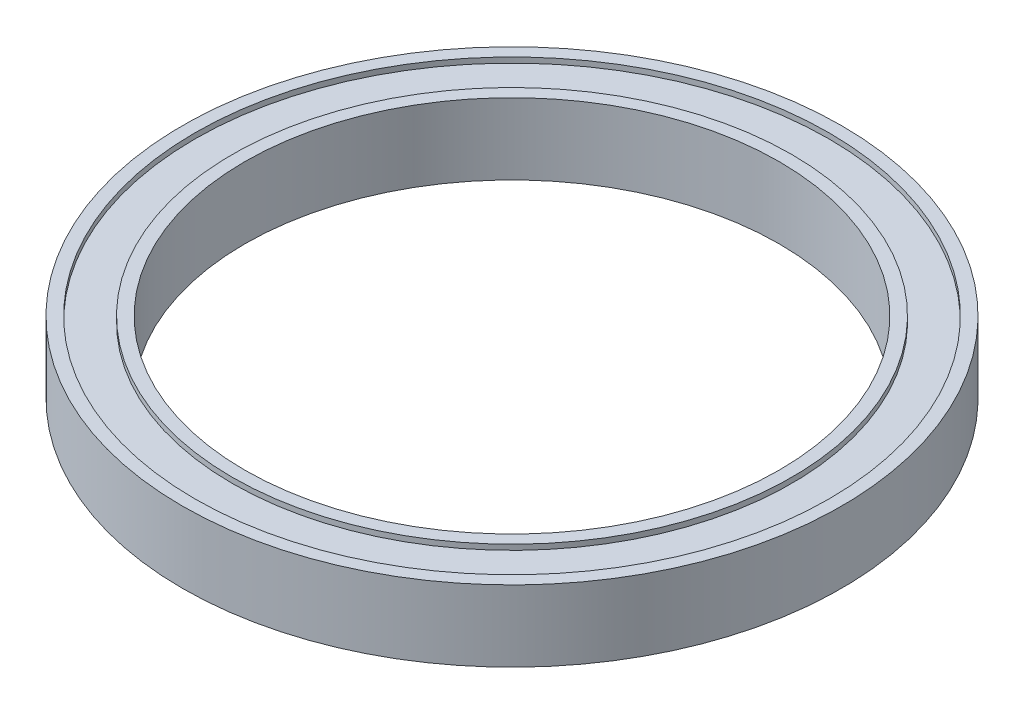
ISO-10303-21;
HEADER;
FILE_DESCRIPTION(('STEP AP214'),'2;1');
FILE_NAME('part.step','',(''),(''),'','','');
FILE_SCHEMA(('AUTOMOTIVE_DESIGN { 1 0 10303 214 1 1 1 1 }'));
ENDSEC;
DATA;
#1=APPLICATION_CONTEXT('core data for automotive mechanical design processes');
#2=APPLICATION_PROTOCOL_DEFINITION('international standard','automotive_design',2000,#1);
#3=PRODUCT_CONTEXT('',#1,'mechanical');
#4=PRODUCT('Part','Part','',(#3));
#5=PRODUCT_RELATED_PRODUCT_CATEGORY('part','',(#4));
#6=PRODUCT_DEFINITION_FORMATION('','',#4);
#7=PRODUCT_DEFINITION_CONTEXT('part definition',#1,'design');
#8=PRODUCT_DEFINITION('design','',#6,#7);
#9=PRODUCT_DEFINITION_SHAPE('','',#8);
#10=(LENGTH_UNIT() NAMED_UNIT(*) SI_UNIT(.MILLI.,.METRE.));
#11=(NAMED_UNIT(*) PLANE_ANGLE_UNIT() SI_UNIT($,.RADIAN.));
#12=(NAMED_UNIT(*) SI_UNIT($,.STERADIAN.) SOLID_ANGLE_UNIT());
#13=UNCERTAINTY_MEASURE_WITH_UNIT(LENGTH_MEASURE(1.E-05),#10,'distance_accuracy_value','');
#14=(GEOMETRIC_REPRESENTATION_CONTEXT(3) GLOBAL_UNCERTAINTY_ASSIGNED_CONTEXT((#13)) GLOBAL_UNIT_ASSIGNED_CONTEXT((#10,
#11,#12)) REPRESENTATION_CONTEXT('',''));
#15=CARTESIAN_POINT('',(0.,0.,0.));
#16=DIRECTION('',(0.,0.,1.));
#17=DIRECTION('',(1.,0.,0.));
#18=AXIS2_PLACEMENT_3D('',#15,#16,#17);
#19=CARTESIAN_POINT('',(0.,0.,0.));
#20=DIRECTION('',(0.,1.,0.));
#21=DIRECTION('',(0.,0.,1.));
#22=AXIS2_PLACEMENT_3D('',#19,#20,#21);
#23=PLANE('',#22);
#24=CARTESIAN_POINT('',(0.,0.,0.));
#25=DIRECTION('',(0.,1.,0.));
#26=DIRECTION('',(0.,0.,1.));
#27=AXIS2_PLACEMENT_3D('',#24,#25,#26);
#28=CIRCLE('',#27,15.);
#29=CARTESIAN_POINT('',(0.,0.,15.));
#30=VERTEX_POINT('',#29);
#31=EDGE_CURVE('E51',#30,#30,#28,.T.);
#32=ORIENTED_EDGE('',*,*,#31,.T.);
#33=EDGE_LOOP('',(#32));
#34=FACE_BOUND('',#33,.T.);
#35=CARTESIAN_POINT('',(0.,0.,0.));
#36=DIRECTION('',(0.,1.,0.));
#37=DIRECTION('',(0.,0.,1.));
#38=AXIS2_PLACEMENT_3D('',#35,#36,#37);
#39=CIRCLE('',#38,15.7);
#40=CARTESIAN_POINT('',(0.,0.,15.7));
#41=VERTEX_POINT('',#40);
#42=EDGE_CURVE('E75',#41,#41,#39,.T.);
#43=ORIENTED_EDGE('',*,*,#42,.F.);
#44=EDGE_LOOP('',(#43));
#45=FACE_BOUND('',#44,.T.);
#46=ADVANCED_FACE('F38',(#34,#45),#23,.F.);
#47=CARTESIAN_POINT('',(0.,4.,0.));
#48=DIRECTION('',(0.,1.,0.));
#49=DIRECTION('',(0.,0.,1.));
#50=AXIS2_PLACEMENT_3D('',#47,#48,#49);
#51=PLANE('',#50);
#52=CARTESIAN_POINT('',(0.,4.,0.));
#53=DIRECTION('',(0.,1.,0.));
#54=DIRECTION('',(0.,0.,1.));
#55=AXIS2_PLACEMENT_3D('',#52,#53,#54);
#56=CIRCLE('',#55,15.);
#57=CARTESIAN_POINT('',(0.,4.,15.));
#58=VERTEX_POINT('',#57);
#59=EDGE_CURVE('E49',#58,#58,#56,.T.);
#60=ORIENTED_EDGE('',*,*,#59,.F.);
#61=EDGE_LOOP('',(#60));
#62=FACE_BOUND('',#61,.T.);
#63=CARTESIAN_POINT('',(0.,4.,0.));
#64=DIRECTION('',(0.,1.,0.));
#65=DIRECTION('',(0.,0.,1.));
#66=AXIS2_PLACEMENT_3D('',#63,#64,#65);
#67=CIRCLE('',#66,15.7);
#68=CARTESIAN_POINT('',(0.,4.,15.7));
#69=VERTEX_POINT('',#68);
#70=EDGE_CURVE('E63',#69,#69,#67,.T.);
#71=ORIENTED_EDGE('',*,*,#70,.T.);
#72=EDGE_LOOP('',(#71));
#73=FACE_BOUND('',#72,.T.);
#74=ADVANCED_FACE('F91',(#62,#73),#51,.T.);
#75=CARTESIAN_POINT('',(0.,4.,0.));
#76=DIRECTION('',(0.,1.,0.));
#77=DIRECTION('',(0.,0.,1.));
#78=AXIS2_PLACEMENT_3D('',#75,#76,#77);
#79=CIRCLE('',#78,17.8);
#80=CARTESIAN_POINT('',(0.,4.,17.8));
#81=VERTEX_POINT('',#80);
#82=EDGE_CURVE('E57',#81,#81,#79,.T.);
#83=ORIENTED_EDGE('',*,*,#82,.F.);
#84=EDGE_LOOP('',(#83));
#85=FACE_BOUND('',#84,.T.);
#86=CARTESIAN_POINT('',(0.,4.,0.));
#87=DIRECTION('',(0.,1.,0.));
#88=DIRECTION('',(0.,0.,1.));
#89=AXIS2_PLACEMENT_3D('',#86,#87,#88);
#90=CIRCLE('',#89,18.5);
#91=CARTESIAN_POINT('',(0.,4.,18.5));
#92=VERTEX_POINT('',#91);
#93=EDGE_CURVE('E10',#92,#92,#90,.T.);
#94=ORIENTED_EDGE('',*,*,#93,.T.);
#95=EDGE_LOOP('',(#94));
#96=FACE_BOUND('',#95,.T.);
#97=ADVANCED_FACE('F97',(#85,#96),#51,.T.);
#98=CARTESIAN_POINT('',(0.,0.,0.));
#99=DIRECTION('',(0.,1.,0.));
#100=DIRECTION('',(0.,0.,1.));
#101=AXIS2_PLACEMENT_3D('',#98,#99,#100);
#102=CIRCLE('',#101,17.8);
#103=CARTESIAN_POINT('',(0.,0.,17.8));
#104=VERTEX_POINT('',#103);
#105=EDGE_CURVE('E69',#104,#104,#102,.T.);
#106=ORIENTED_EDGE('',*,*,#105,.T.);
#107=EDGE_LOOP('',(#106));
#108=FACE_BOUND('',#107,.T.);
#109=CARTESIAN_POINT('',(0.,0.,0.));
#110=DIRECTION('',(0.,1.,0.));
#111=DIRECTION('',(0.,0.,1.));
#112=AXIS2_PLACEMENT_3D('',#109,#110,#111);
#113=CIRCLE('',#112,18.5);
#114=CARTESIAN_POINT('',(0.,0.,18.5));
#115=VERTEX_POINT('',#114);
#116=EDGE_CURVE('E42',#115,#115,#113,.T.);
#117=ORIENTED_EDGE('',*,*,#116,.F.);
#118=EDGE_LOOP('',(#117));
#119=FACE_BOUND('',#118,.T.);
#120=ADVANCED_FACE('F93',(#108,#119),#23,.F.);
#121=CARTESIAN_POINT('',(0.,4.,0.));
#122=DIRECTION('',(0.,-1.,0.));
#123=DIRECTION('',(0.,0.,-1.));
#124=AXIS2_PLACEMENT_3D('',#121,#122,#123);
#125=CYLINDRICAL_SURFACE('',#124,18.5);
#126=ORIENTED_EDGE('',*,*,#93,.F.);
#127=EDGE_LOOP('',(#126));
#128=FACE_BOUND('',#127,.T.);
#129=ORIENTED_EDGE('',*,*,#116,.T.);
#130=EDGE_LOOP('',(#129));
#131=FACE_BOUND('',#130,.T.);
#132=ADVANCED_FACE('F40',(#128,#131),#125,.T.);
#133=CARTESIAN_POINT('',(0.,4.,0.));
#134=DIRECTION('',(0.,-1.,0.));
#135=DIRECTION('',(0.,0.,-1.));
#136=AXIS2_PLACEMENT_3D('',#133,#134,#135);
#137=CYLINDRICAL_SURFACE('',#136,15.);
#138=ORIENTED_EDGE('',*,*,#59,.T.);
#139=EDGE_LOOP('',(#138));
#140=FACE_BOUND('',#139,.T.);
#141=ORIENTED_EDGE('',*,*,#31,.F.);
#142=EDGE_LOOP('',(#141));
#143=FACE_BOUND('',#142,.T.);
#144=ADVANCED_FACE('F106',(#140,#143),#137,.F.);
#145=CARTESIAN_POINT('',(0.,3.7,0.));
#146=DIRECTION('',(0.,1.,0.));
#147=DIRECTION('',(0.,0.,1.));
#148=AXIS2_PLACEMENT_3D('',#145,#146,#147);
#149=CYLINDRICAL_SURFACE('',#148,17.8);
#150=CARTESIAN_POINT('',(0.,3.7,0.));
#151=DIRECTION('',(0.,1.,0.));
#152=DIRECTION('',(0.,0.,1.));
#153=AXIS2_PLACEMENT_3D('',#150,#151,#152);
#154=CIRCLE('',#153,17.8);
#155=CARTESIAN_POINT('',(0.,3.7,17.8));
#156=VERTEX_POINT('',#155);
#157=EDGE_CURVE('E54',#156,#156,#154,.T.);
#158=ORIENTED_EDGE('',*,*,#157,.F.);
#159=EDGE_LOOP('',(#158));
#160=FACE_BOUND('',#159,.T.);
#161=ORIENTED_EDGE('',*,*,#82,.T.);
#162=EDGE_LOOP('',(#161));
#163=FACE_BOUND('',#162,.T.);
#164=ADVANCED_FACE('F130',(#160,#163),#149,.F.);
#165=CARTESIAN_POINT('',(0.,3.7,0.));
#166=DIRECTION('',(0.,1.,0.));
#167=DIRECTION('',(0.,0.,1.));
#168=AXIS2_PLACEMENT_3D('',#165,#166,#167);
#169=PLANE('',#168);
#170=CARTESIAN_POINT('',(0.,3.7,0.));
#171=DIRECTION('',(0.,1.,0.));
#172=DIRECTION('',(0.,0.,1.));
#173=AXIS2_PLACEMENT_3D('',#170,#171,#172);
#174=CIRCLE('',#173,15.7);
#175=CARTESIAN_POINT('',(0.,3.7,15.7));
#176=VERTEX_POINT('',#175);
#177=EDGE_CURVE('E60',#176,#176,#174,.T.);
#178=ORIENTED_EDGE('',*,*,#177,.F.);
#179=EDGE_LOOP('',(#178));
#180=FACE_BOUND('',#179,.T.);
#181=ORIENTED_EDGE('',*,*,#157,.T.);
#182=EDGE_LOOP('',(#181));
#183=FACE_BOUND('',#182,.T.);
#184=ADVANCED_FACE('F126',(#180,#183),#169,.T.);
#185=CARTESIAN_POINT('',(0.,3.7,0.));
#186=DIRECTION('',(0.,1.,0.));
#187=DIRECTION('',(0.,0.,1.));
#188=AXIS2_PLACEMENT_3D('',#185,#186,#187);
#189=CYLINDRICAL_SURFACE('',#188,15.7);
#190=ORIENTED_EDGE('',*,*,#177,.T.);
#191=EDGE_LOOP('',(#190));
#192=FACE_BOUND('',#191,.T.);
#193=ORIENTED_EDGE('',*,*,#70,.F.);
#194=EDGE_LOOP('',(#193));
#195=FACE_BOUND('',#194,.T.);
#196=ADVANCED_FACE('F120',(#192,#195),#189,.T.);
#197=CARTESIAN_POINT('',(0.,0.3,0.));
#198=DIRECTION('',(0.,-1.,0.));
#199=DIRECTION('',(0.,0.,1.));
#200=AXIS2_PLACEMENT_3D('',#197,#198,#199);
#201=PLANE('',#200);
#202=CARTESIAN_POINT('',(0.,0.3,0.));
#203=DIRECTION('',(0.,1.,0.));
#204=DIRECTION('',(0.,0.,1.));
#205=AXIS2_PLACEMENT_3D('',#202,#203,#204);
#206=CIRCLE('',#205,17.8);
#207=CARTESIAN_POINT('',(0.,0.3,17.8));
#208=VERTEX_POINT('',#207);
#209=EDGE_CURVE('E66',#208,#208,#206,.T.);
#210=ORIENTED_EDGE('',*,*,#209,.F.);
#211=EDGE_LOOP('',(#210));
#212=FACE_BOUND('',#211,.T.);
#213=CARTESIAN_POINT('',(0.,0.3,0.));
#214=DIRECTION('',(0.,1.,0.));
#215=DIRECTION('',(0.,0.,1.));
#216=AXIS2_PLACEMENT_3D('',#213,#214,#215);
#217=CIRCLE('',#216,15.7);
#218=CARTESIAN_POINT('',(0.,0.3,15.7));
#219=VERTEX_POINT('',#218);
#220=EDGE_CURVE('E72',#219,#219,#217,.T.);
#221=ORIENTED_EDGE('',*,*,#220,.T.);
#222=EDGE_LOOP('',(#221));
#223=FACE_BOUND('',#222,.T.);
#224=ADVANCED_FACE('F81',(#212,#223),#201,.T.);
#225=CARTESIAN_POINT('',(0.,0.3,0.));
#226=DIRECTION('',(0.,-1.,0.));
#227=DIRECTION('',(0.,0.,-1.));
#228=AXIS2_PLACEMENT_3D('',#225,#226,#227);
#229=CYLINDRICAL_SURFACE('',#228,17.8);
#230=ORIENTED_EDGE('',*,*,#209,.T.);
#231=EDGE_LOOP('',(#230));
#232=FACE_BOUND('',#231,.T.);
#233=ORIENTED_EDGE('',*,*,#105,.F.);
#234=EDGE_LOOP('',(#233));
#235=FACE_BOUND('',#234,.T.);
#236=ADVANCED_FACE('F86',(#232,#235),#229,.F.);
#237=CARTESIAN_POINT('',(0.,0.3,0.));
#238=DIRECTION('',(0.,-1.,0.));
#239=DIRECTION('',(0.,0.,-1.));
#240=AXIS2_PLACEMENT_3D('',#237,#238,#239);
#241=CYLINDRICAL_SURFACE('',#240,15.7);
#242=ORIENTED_EDGE('',*,*,#220,.F.);
#243=EDGE_LOOP('',(#242));
#244=FACE_BOUND('',#243,.T.);
#245=ORIENTED_EDGE('',*,*,#42,.T.);
#246=EDGE_LOOP('',(#245));
#247=FACE_BOUND('',#246,.T.);
#248=ADVANCED_FACE('F83',(#244,#247),#241,.T.);
#249=CLOSED_SHELL('',(#46,#74,#97,#120,#132,#144,#164,#184,#196,#224,#236,#248));
#250=MANIFOLD_SOLID_BREP('B2',#249);
#251=ADVANCED_BREP_SHAPE_REPRESENTATION('',(#18,#250),#14);
#252=SHAPE_DEFINITION_REPRESENTATION(#9,#251);
ENDSEC;
END-ISO-10303-21;
